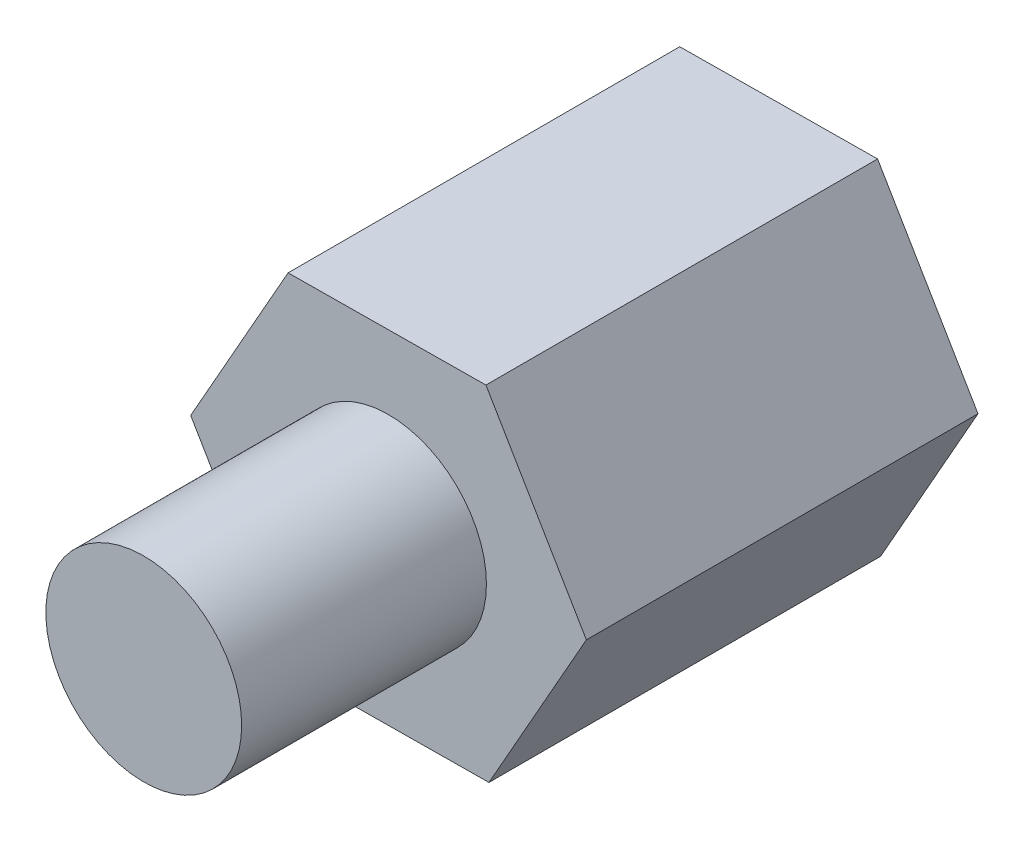
ISO-10303-21;
HEADER;
FILE_DESCRIPTION(('STEP AP214'),'2;1');
FILE_NAME('part.step','',(''),(''),'','','');
FILE_SCHEMA(('AUTOMOTIVE_DESIGN { 1 0 10303 214 1 1 1 1 }'));
ENDSEC;
DATA;
#1=APPLICATION_CONTEXT('core data for automotive mechanical design processes');
#2=APPLICATION_PROTOCOL_DEFINITION('international standard','automotive_design',2000,#1);
#3=PRODUCT_CONTEXT('',#1,'mechanical');
#4=PRODUCT('Part','Part','',(#3));
#5=PRODUCT_RELATED_PRODUCT_CATEGORY('part','',(#4));
#6=PRODUCT_DEFINITION_FORMATION('','',#4);
#7=PRODUCT_DEFINITION_CONTEXT('part definition',#1,'design');
#8=PRODUCT_DEFINITION('design','',#6,#7);
#9=PRODUCT_DEFINITION_SHAPE('','',#8);
#10=(LENGTH_UNIT() NAMED_UNIT(*) SI_UNIT(.MILLI.,.METRE.));
#11=(NAMED_UNIT(*) PLANE_ANGLE_UNIT() SI_UNIT($,.RADIAN.));
#12=(NAMED_UNIT(*) SI_UNIT($,.STERADIAN.) SOLID_ANGLE_UNIT());
#13=UNCERTAINTY_MEASURE_WITH_UNIT(LENGTH_MEASURE(1.E-05),#10,'distance_accuracy_value','');
#14=(GEOMETRIC_REPRESENTATION_CONTEXT(3) GLOBAL_UNCERTAINTY_ASSIGNED_CONTEXT((#13)) GLOBAL_UNIT_ASSIGNED_CONTEXT((#10,
#11,#12)) REPRESENTATION_CONTEXT('',''));
#15=CARTESIAN_POINT('',(0.,0.,0.));
#16=DIRECTION('',(0.,0.,1.));
#17=DIRECTION('',(1.,0.,0.));
#18=AXIS2_PLACEMENT_3D('',#15,#16,#17);
#19=CARTESIAN_POINT('',(0.,0.,13.));
#20=DIRECTION('',(0.,0.,-1.));
#21=DIRECTION('',(-1.,0.,0.));
#22=AXIS2_PLACEMENT_3D('',#19,#20,#21);
#23=CYLINDRICAL_SURFACE('',#22,2.);
#24=CARTESIAN_POINT('',(0.,0.,13.));
#25=DIRECTION('',(0.,0.,1.));
#26=DIRECTION('',(1.,0.,0.));
#27=AXIS2_PLACEMENT_3D('',#24,#25,#26);
#28=CIRCLE('',#27,2.);
#29=CARTESIAN_POINT('',(2.,0.,13.));
#30=VERTEX_POINT('',#29);
#31=EDGE_CURVE('E11',#30,#30,#28,.T.);
#32=ORIENTED_EDGE('',*,*,#31,.F.);
#33=EDGE_LOOP('',(#32));
#34=FACE_BOUND('',#33,.T.);
#35=CARTESIAN_POINT('',(0.,0.,8.));
#36=DIRECTION('',(0.,0.,1.));
#37=DIRECTION('',(1.,0.,0.));
#38=AXIS2_PLACEMENT_3D('',#35,#36,#37);
#39=CIRCLE('',#38,2.);
#40=CARTESIAN_POINT('',(2.,0.,8.));
#41=VERTEX_POINT('',#40);
#42=EDGE_CURVE('E50',#41,#41,#39,.T.);
#43=ORIENTED_EDGE('',*,*,#42,.T.);
#44=EDGE_LOOP('',(#43));
#45=FACE_BOUND('',#44,.T.);
#46=ADVANCED_FACE('F47',(#34,#45),#23,.T.);
#47=CARTESIAN_POINT('',(0.,0.,13.));
#48=DIRECTION('',(0.,0.,1.));
#49=DIRECTION('',(1.,0.,0.));
#50=AXIS2_PLACEMENT_3D('',#47,#48,#49);
#51=PLANE('',#50);
#52=ORIENTED_EDGE('',*,*,#31,.T.);
#53=EDGE_LOOP('',(#52));
#54=FACE_BOUND('',#53,.T.);
#55=ADVANCED_FACE('F62',(#54),#51,.T.);
#56=CARTESIAN_POINT('',(0.,0.,8.));
#57=DIRECTION('',(0.,0.,1.));
#58=DIRECTION('',(1.,0.,0.));
#59=AXIS2_PLACEMENT_3D('',#56,#57,#58);
#60=PLANE('',#59);
#61=ORIENTED_EDGE('',*,*,#42,.F.);
#62=EDGE_LOOP('',(#61));
#63=FACE_BOUND('',#62,.T.);
#64=ADVANCED_FACE('F60',(#63),#60,.F.);
#65=CLOSED_SHELL('',(#46,#55,#64));
#66=MANIFOLD_SOLID_BREP('B2',#65);
#67=CARTESIAN_POINT('',(0.,0.,8.));
#68=DIRECTION('',(0.,0.,1.));
#69=DIRECTION('',(1.,0.,0.));
#70=AXIS2_PLACEMENT_3D('',#67,#68,#69);
#71=PLANE('',#70);
#72=DIRECTION('',(0.999961257640527,0.00880245522430722,0.));
#73=VECTOR('',#72,1.);
#74=CARTESIAN_POINT('',(-1.98983906118775,-3.51765175136834,8.));
#75=LINE('',#74,#73);
#76=CARTESIAN_POINT('',(-1.98983906118775,-3.51765175136834,8.));
#77=VERTEX_POINT('',#76);
#78=CARTESIAN_POINT('',(2.05145624775792,-3.48207705211536,8.));
#79=VERTEX_POINT('',#78);
#80=EDGE_CURVE('E195',#77,#79,#75,.T.);
#81=ORIENTED_EDGE('',*,*,#80,.T.);
#82=DIRECTION('',(0.492357478980338,0.870393079529086,0.));
#83=VECTOR('',#82,1.);
#84=CARTESIAN_POINT('',(2.05145624775792,-3.48207705211536,8.));
#85=LINE('',#84,#83);
#86=CARTESIAN_POINT('',(4.04129530894568,0.0355746992529791,8.));
#87=VERTEX_POINT('',#86);
#88=EDGE_CURVE('E143',#79,#87,#85,.T.);
#89=ORIENTED_EDGE('',*,*,#88,.T.);
#90=DIRECTION('',(-0.507603778660189,0.861590624304779,0.));
#91=VECTOR('',#90,1.);
#92=CARTESIAN_POINT('',(4.04129530894568,0.0355746992529791,8.));
#93=LINE('',#92,#91);
#94=CARTESIAN_POINT('',(1.98983906118776,3.51765175136834,8.));
#95=VERTEX_POINT('',#94);
#96=EDGE_CURVE('E156',#87,#95,#93,.T.);
#97=ORIENTED_EDGE('',*,*,#96,.T.);
#98=DIRECTION('',(-0.999961257640527,-0.00880245522430723,0.));
#99=VECTOR('',#98,1.);
#100=CARTESIAN_POINT('',(1.98983906118776,3.51765175136834,8.));
#101=LINE('',#100,#99);
#102=CARTESIAN_POINT('',(-2.05145624775791,3.48207705211536,8.));
#103=VERTEX_POINT('',#102);
#104=EDGE_CURVE('E150',#95,#103,#101,.T.);
#105=ORIENTED_EDGE('',*,*,#104,.T.);
#106=DIRECTION('',(-0.492357478980338,-0.870393079529086,0.));
#107=VECTOR('',#106,1.);
#108=CARTESIAN_POINT('',(-2.05145624775791,3.48207705211536,8.));
#109=LINE('',#108,#107);
#110=CARTESIAN_POINT('',(-4.04129530894568,-0.0355746992529825,8.));
#111=VERTEX_POINT('',#110);
#112=EDGE_CURVE('E154',#103,#111,#109,.T.);
#113=ORIENTED_EDGE('',*,*,#112,.T.);
#114=DIRECTION('',(0.507603778660189,-0.861590624304779,0.));
#115=VECTOR('',#114,1.);
#116=CARTESIAN_POINT('',(-4.04129530894568,-0.0355746992529825,8.));
#117=LINE('',#116,#115);
#118=EDGE_CURVE('E106',#111,#77,#117,.T.);
#119=ORIENTED_EDGE('',*,*,#118,.T.);
#120=EDGE_LOOP('',(#81,#89,#97,#105,#113,#119));
#121=FACE_BOUND('',#120,.T.);
#122=CARTESIAN_POINT('',(0.,0.,8.));
#123=DIRECTION('',(0.,0.,1.));
#124=DIRECTION('',(1.,0.,0.));
#125=AXIS2_PLACEMENT_3D('',#122,#123,#124);
#126=CIRCLE('',#125,2.);
#127=CARTESIAN_POINT('',(2.,0.,8.));
#128=VERTEX_POINT('',#127);
#129=EDGE_CURVE('E183',#128,#128,#126,.T.);
#130=ORIENTED_EDGE('',*,*,#129,.F.);
#131=EDGE_LOOP('',(#130));
#132=FACE_BOUND('',#131,.T.);
#133=ADVANCED_FACE('F88',(#121,#132),#71,.T.);
#134=CARTESIAN_POINT('',(0.,0.,0.));
#135=DIRECTION('',(0.,0.,1.));
#136=DIRECTION('',(1.,0.,0.));
#137=AXIS2_PLACEMENT_3D('',#134,#135,#136);
#138=PLANE('',#137);
#139=DIRECTION('',(0.999961257640527,0.00880245522430722,0.));
#140=VECTOR('',#139,1.);
#141=CARTESIAN_POINT('',(-1.98983906118775,-3.51765175136834,0.));
#142=LINE('',#141,#140);
#143=CARTESIAN_POINT('',(-1.98983906118775,-3.51765175136834,0.));
#144=VERTEX_POINT('',#143);
#145=CARTESIAN_POINT('',(2.05145624775792,-3.48207705211536,0.));
#146=VERTEX_POINT('',#145);
#147=EDGE_CURVE('E178',#144,#146,#142,.T.);
#148=ORIENTED_EDGE('',*,*,#147,.F.);
#149=DIRECTION('',(0.507603778660189,-0.861590624304779,0.));
#150=VECTOR('',#149,1.);
#151=CARTESIAN_POINT('',(-4.04129530894568,-0.0355746992529825,0.));
#152=LINE('',#151,#150);
#153=CARTESIAN_POINT('',(-4.04129530894568,-0.0355746992529825,0.));
#154=VERTEX_POINT('',#153);
#155=EDGE_CURVE('E135',#154,#144,#152,.T.);
#156=ORIENTED_EDGE('',*,*,#155,.F.);
#157=DIRECTION('',(-0.492357478980338,-0.870393079529086,0.));
#158=VECTOR('',#157,1.);
#159=CARTESIAN_POINT('',(-2.05145624775791,3.48207705211536,0.));
#160=LINE('',#159,#158);
#161=CARTESIAN_POINT('',(-2.05145624775791,3.48207705211536,0.));
#162=VERTEX_POINT('',#161);
#163=EDGE_CURVE('E129',#162,#154,#160,.T.);
#164=ORIENTED_EDGE('',*,*,#163,.F.);
#165=DIRECTION('',(-0.999961257640527,-0.00880245522430723,0.));
#166=VECTOR('',#165,1.);
#167=CARTESIAN_POINT('',(1.98983906118776,3.51765175136834,0.));
#168=LINE('',#167,#166);
#169=CARTESIAN_POINT('',(1.98983906118776,3.51765175136834,0.));
#170=VERTEX_POINT('',#169);
#171=EDGE_CURVE('E165',#170,#162,#168,.T.);
#172=ORIENTED_EDGE('',*,*,#171,.F.);
#173=DIRECTION('',(-0.507603778660189,0.861590624304779,0.));
#174=VECTOR('',#173,1.);
#175=CARTESIAN_POINT('',(4.04129530894568,0.0355746992529791,0.));
#176=LINE('',#175,#174);
#177=CARTESIAN_POINT('',(4.04129530894568,0.0355746992529791,0.));
#178=VERTEX_POINT('',#177);
#179=EDGE_CURVE('E186',#178,#170,#176,.T.);
#180=ORIENTED_EDGE('',*,*,#179,.F.);
#181=DIRECTION('',(0.492357478980338,0.870393079529086,0.));
#182=VECTOR('',#181,1.);
#183=CARTESIAN_POINT('',(2.05145624775792,-3.48207705211536,0.));
#184=LINE('',#183,#182);
#185=EDGE_CURVE('E182',#146,#178,#184,.T.);
#186=ORIENTED_EDGE('',*,*,#185,.F.);
#187=EDGE_LOOP('',(#148,#156,#164,#172,#180,#186));
#188=FACE_BOUND('',#187,.T.);
#189=CARTESIAN_POINT('',(0.,0.,0.));
#190=DIRECTION('',(0.,0.,1.));
#191=DIRECTION('',(1.,0.,0.));
#192=AXIS2_PLACEMENT_3D('',#189,#190,#191);
#193=CIRCLE('',#192,2.);
#194=CARTESIAN_POINT('',(2.,0.,0.));
#195=VERTEX_POINT('',#194);
#196=EDGE_CURVE('E292',#195,#195,#193,.T.);
#197=ORIENTED_EDGE('',*,*,#196,.T.);
#198=EDGE_LOOP('',(#197));
#199=FACE_BOUND('',#198,.T.);
#200=ADVANCED_FACE('F208',(#188,#199),#138,.F.);
#201=CARTESIAN_POINT('',(-1.98983906118775,-3.51765175136834,8.));
#202=DIRECTION('',(-0.00880245522430722,0.999961257640527,0.));
#203=DIRECTION('',(-0.999961257640527,-0.00880245522430722,0.));
#204=AXIS2_PLACEMENT_3D('',#201,#202,#203);
#205=PLANE('',#204);
#206=ORIENTED_EDGE('',*,*,#147,.T.);
#207=DIRECTION('',(0.,0.,-1.));
#208=VECTOR('',#207,1.);
#209=CARTESIAN_POINT('',(2.05145624775792,-3.48207705211536,8.));
#210=LINE('',#209,#208);
#211=EDGE_CURVE('E45',#79,#146,#210,.T.);
#212=ORIENTED_EDGE('',*,*,#211,.F.);
#213=ORIENTED_EDGE('',*,*,#80,.F.);
#214=DIRECTION('',(0.,0.,-1.));
#215=VECTOR('',#214,1.);
#216=CARTESIAN_POINT('',(-1.98983906118775,-3.51765175136834,8.));
#217=LINE('',#216,#215);
#218=EDGE_CURVE('E174',#77,#144,#217,.T.);
#219=ORIENTED_EDGE('',*,*,#218,.T.);
#220=EDGE_LOOP('',(#206,#212,#213,#219));
#221=FACE_BOUND('',#220,.T.);
#222=ADVANCED_FACE('F90',(#221),#205,.F.);
#223=CARTESIAN_POINT('',(2.05145624775792,-3.48207705211536,8.));
#224=DIRECTION('',(-0.870393079529086,0.492357478980338,0.));
#225=DIRECTION('',(-0.492357478980338,-0.870393079529086,0.));
#226=AXIS2_PLACEMENT_3D('',#223,#224,#225);
#227=PLANE('',#226);
#228=ORIENTED_EDGE('',*,*,#185,.T.);
#229=DIRECTION('',(0.,0.,-1.));
#230=VECTOR('',#229,1.);
#231=CARTESIAN_POINT('',(4.04129530894568,0.0355746992529791,8.));
#232=LINE('',#231,#230);
#233=EDGE_CURVE('E98',#87,#178,#232,.T.);
#234=ORIENTED_EDGE('',*,*,#233,.F.);
#235=ORIENTED_EDGE('',*,*,#88,.F.);
#236=ORIENTED_EDGE('',*,*,#211,.T.);
#237=EDGE_LOOP('',(#228,#234,#235,#236));
#238=FACE_BOUND('',#237,.T.);
#239=ADVANCED_FACE('F233',(#238),#227,.F.);
#240=CARTESIAN_POINT('',(4.04129530894568,0.0355746992529791,8.));
#241=DIRECTION('',(-0.861590624304779,-0.507603778660189,0.));
#242=DIRECTION('',(0.507603778660189,-0.861590624304779,0.));
#243=AXIS2_PLACEMENT_3D('',#240,#241,#242);
#244=PLANE('',#243);
#245=ORIENTED_EDGE('',*,*,#179,.T.);
#246=DIRECTION('',(0.,0.,-1.));
#247=VECTOR('',#246,1.);
#248=CARTESIAN_POINT('',(1.98983906118776,3.51765175136834,8.));
#249=LINE('',#248,#247);
#250=EDGE_CURVE('E167',#95,#170,#249,.T.);
#251=ORIENTED_EDGE('',*,*,#250,.F.);
#252=ORIENTED_EDGE('',*,*,#96,.F.);
#253=ORIENTED_EDGE('',*,*,#233,.T.);
#254=EDGE_LOOP('',(#245,#251,#252,#253));
#255=FACE_BOUND('',#254,.T.);
#256=ADVANCED_FACE('F205',(#255),#244,.F.);
#257=CARTESIAN_POINT('',(1.98983906118776,3.51765175136834,8.));
#258=DIRECTION('',(0.00880245522430723,-0.999961257640527,0.));
#259=DIRECTION('',(0.999961257640527,0.00880245522430723,0.));
#260=AXIS2_PLACEMENT_3D('',#257,#258,#259);
#261=PLANE('',#260);
#262=ORIENTED_EDGE('',*,*,#171,.T.);
#263=DIRECTION('',(0.,0.,-1.));
#264=VECTOR('',#263,1.);
#265=CARTESIAN_POINT('',(-2.05145624775791,3.48207705211536,8.));
#266=LINE('',#265,#264);
#267=EDGE_CURVE('E162',#103,#162,#266,.T.);
#268=ORIENTED_EDGE('',*,*,#267,.F.);
#269=ORIENTED_EDGE('',*,*,#104,.F.);
#270=ORIENTED_EDGE('',*,*,#250,.T.);
#271=EDGE_LOOP('',(#262,#268,#269,#270));
#272=FACE_BOUND('',#271,.T.);
#273=ADVANCED_FACE('F163',(#272),#261,.F.);
#274=CARTESIAN_POINT('',(-2.05145624775791,3.48207705211536,8.));
#275=DIRECTION('',(0.870393079529086,-0.492357478980338,0.));
#276=DIRECTION('',(0.492357478980338,0.870393079529086,0.));
#277=AXIS2_PLACEMENT_3D('',#274,#275,#276);
#278=PLANE('',#277);
#279=ORIENTED_EDGE('',*,*,#163,.T.);
#280=DIRECTION('',(0.,0.,-1.));
#281=VECTOR('',#280,1.);
#282=CARTESIAN_POINT('',(-4.04129530894568,-0.0355746992529825,8.));
#283=LINE('',#282,#281);
#284=EDGE_CURVE('E168',#111,#154,#283,.T.);
#285=ORIENTED_EDGE('',*,*,#284,.F.);
#286=ORIENTED_EDGE('',*,*,#112,.F.);
#287=ORIENTED_EDGE('',*,*,#267,.T.);
#288=EDGE_LOOP('',(#279,#285,#286,#287));
#289=FACE_BOUND('',#288,.T.);
#290=ADVANCED_FACE('F170',(#289),#278,.F.);
#291=CARTESIAN_POINT('',(-4.04129530894568,-0.0355746992529825,8.));
#292=DIRECTION('',(0.861590624304779,0.507603778660189,0.));
#293=DIRECTION('',(-0.507603778660189,0.861590624304779,0.));
#294=AXIS2_PLACEMENT_3D('',#291,#292,#293);
#295=PLANE('',#294);
#296=ORIENTED_EDGE('',*,*,#155,.T.);
#297=ORIENTED_EDGE('',*,*,#218,.F.);
#298=ORIENTED_EDGE('',*,*,#118,.F.);
#299=ORIENTED_EDGE('',*,*,#284,.T.);
#300=EDGE_LOOP('',(#296,#297,#298,#299));
#301=FACE_BOUND('',#300,.T.);
#302=ADVANCED_FACE('F213',(#301),#295,.F.);
#303=CARTESIAN_POINT('',(0.,0.,8.));
#304=DIRECTION('',(0.,0.,-1.));
#305=DIRECTION('',(-1.,0.,0.));
#306=AXIS2_PLACEMENT_3D('',#303,#304,#305);
#307=CYLINDRICAL_SURFACE('',#306,2.);
#308=ORIENTED_EDGE('',*,*,#129,.T.);
#309=EDGE_LOOP('',(#308));
#310=FACE_BOUND('',#309,.T.);
#311=ORIENTED_EDGE('',*,*,#196,.F.);
#312=EDGE_LOOP('',(#311));
#313=FACE_BOUND('',#312,.T.);
#314=ADVANCED_FACE('F215',(#310,#313),#307,.F.);
#315=CLOSED_SHELL('',(#133,#200,#222,#239,#256,#273,#290,#302,#314));
#316=MANIFOLD_SOLID_BREP('B6',#315);
#317=ADVANCED_BREP_SHAPE_REPRESENTATION('',(#18,#66,#316),#14);
#318=SHAPE_DEFINITION_REPRESENTATION(#9,#317);
ENDSEC;
END-ISO-10303-21;
